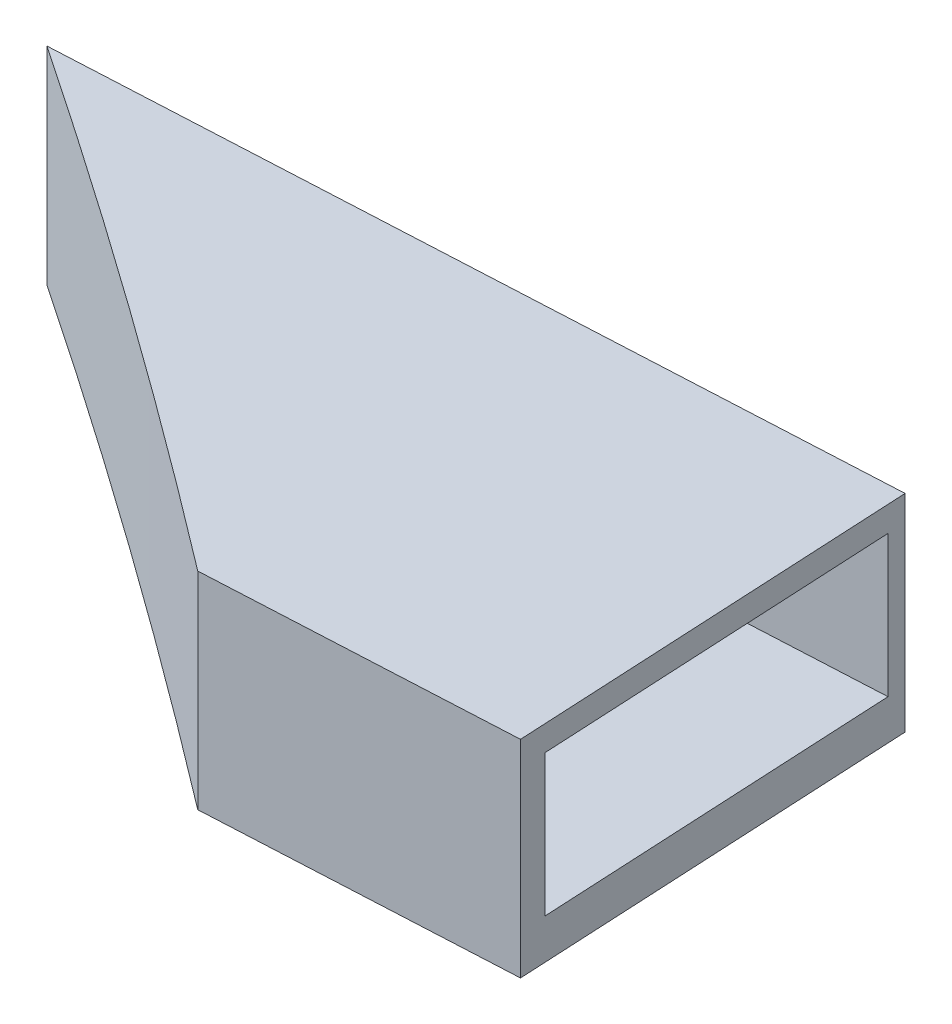
ISO-10303-21;
HEADER;
FILE_DESCRIPTION(('STEP AP214'),'2;1');
FILE_NAME('part.step','',(''),(''),'','','');
FILE_SCHEMA(('AUTOMOTIVE_DESIGN { 1 0 10303 214 1 1 1 1 }'));
ENDSEC;
DATA;
#1=APPLICATION_CONTEXT('core data for automotive mechanical design processes');
#2=APPLICATION_PROTOCOL_DEFINITION('international standard','automotive_design',2000,#1);
#3=PRODUCT_CONTEXT('',#1,'mechanical');
#4=PRODUCT('Part','Part','',(#3));
#5=PRODUCT_RELATED_PRODUCT_CATEGORY('part','',(#4));
#6=PRODUCT_DEFINITION_FORMATION('','',#4);
#7=PRODUCT_DEFINITION_CONTEXT('part definition',#1,'design');
#8=PRODUCT_DEFINITION('design','',#6,#7);
#9=PRODUCT_DEFINITION_SHAPE('','',#8);
#10=(LENGTH_UNIT() NAMED_UNIT(*) SI_UNIT(.MILLI.,.METRE.));
#11=(NAMED_UNIT(*) PLANE_ANGLE_UNIT() SI_UNIT($,.RADIAN.));
#12=(NAMED_UNIT(*) SI_UNIT($,.STERADIAN.) SOLID_ANGLE_UNIT());
#13=UNCERTAINTY_MEASURE_WITH_UNIT(LENGTH_MEASURE(1.E-05),#10,'distance_accuracy_value','');
#14=(GEOMETRIC_REPRESENTATION_CONTEXT(3) GLOBAL_UNCERTAINTY_ASSIGNED_CONTEXT((#13)) GLOBAL_UNIT_ASSIGNED_CONTEXT((#10,
#11,#12)) REPRESENTATION_CONTEXT('',''));
#15=CARTESIAN_POINT('',(0.,0.,0.));
#16=DIRECTION('',(0.,0.,1.));
#17=DIRECTION('',(1.,0.,0.));
#18=AXIS2_PLACEMENT_3D('',#15,#16,#17);
#19=CARTESIAN_POINT('',(625.440328141311,19.,-824.647674335272));
#20=DIRECTION('',(-0.998701891270845,0.,0.0509365524160916));
#21=DIRECTION('',(0.0509365524160916,0.,0.998701891270845));
#22=AXIS2_PLACEMENT_3D('',#19,#20,#21);
#23=PLANE('',#22);
#24=DIRECTION('',(-0.0509365524160912,0.,-0.998701891270845));
#25=VECTOR('',#24,1.);
#26=CARTESIAN_POINT('',(627.218454590812,3.68936553362982,-789.784336244997));
#27=LINE('',#26,#25);
#28=CARTESIAN_POINT('',(627.218454590812,3.68936553362982,-789.784336244988));
#29=VERTEX_POINT('',#28);
#30=CARTESIAN_POINT('',(625.524814222977,3.68936553362982,-822.991174129753));
#31=VERTEX_POINT('',#30);
#32=EDGE_CURVE('E135',#29,#31,#27,.T.);
#33=ORIENTED_EDGE('',*,*,#32,.F.);
#34=DIRECTION('',(0.,-1.,0.));
#35=VECTOR('',#34,1.);
#36=CARTESIAN_POINT('',(627.218454590812,16.6893655336298,-789.784336244997));
#37=LINE('',#36,#35);
#38=CARTESIAN_POINT('',(627.218454590812,16.6893655336298,-789.784336244997));
#39=VERTEX_POINT('',#38);
#40=EDGE_CURVE('E47',#39,#29,#37,.T.);
#41=ORIENTED_EDGE('',*,*,#40,.F.);
#42=DIRECTION('',(0.0509365524160912,0.,0.998701891270845));
#43=VECTOR('',#42,1.);
#44=CARTESIAN_POINT('',(627.218454590812,16.6893655336298,-789.784336244997));
#45=LINE('',#44,#43);
#46=CARTESIAN_POINT('',(625.524814222977,16.6893655336298,-822.991174129753));
#47=VERTEX_POINT('',#46);
#48=EDGE_CURVE('E126',#47,#39,#45,.T.);
#49=ORIENTED_EDGE('',*,*,#48,.F.);
#50=DIRECTION('',(0.,1.,0.));
#51=VECTOR('',#50,1.);
#52=CARTESIAN_POINT('',(625.524814222977,16.6893655336298,-822.991174129753));
#53=LINE('',#52,#51);
#54=EDGE_CURVE('E129',#31,#47,#53,.T.);
#55=ORIENTED_EDGE('',*,*,#54,.F.);
#56=EDGE_LOOP('',(#33,#41,#49,#55));
#57=FACE_BOUND('',#56,.T.);
#58=DIRECTION('',(-0.0509365524160916,0.,-0.998701891270845));
#59=VECTOR('',#58,1.);
#60=CARTESIAN_POINT('',(625.440328141311,0.,-824.647674335272));
#61=LINE('',#60,#59);
#62=CARTESIAN_POINT('',(627.340180934305,0.,-787.397674335272));
#63=VERTEX_POINT('',#62);
#64=CARTESIAN_POINT('',(625.440328141311,0.,-824.647674335272));
#65=VERTEX_POINT('',#64);
#66=EDGE_CURVE('E141',#63,#65,#61,.T.);
#67=ORIENTED_EDGE('',*,*,#66,.T.);
#68=DIRECTION('',(0.,-1.,0.));
#69=VECTOR('',#68,1.);
#70=CARTESIAN_POINT('',(625.440328141311,19.,-824.647674335272));
#71=LINE('',#70,#69);
#72=CARTESIAN_POINT('',(625.440328141311,19.,-824.647674335272));
#73=VERTEX_POINT('',#72);
#74=EDGE_CURVE('E11',#73,#65,#71,.T.);
#75=ORIENTED_EDGE('',*,*,#74,.F.);
#76=DIRECTION('',(-0.0509365524160916,0.,-0.998701891270845));
#77=VECTOR('',#76,1.);
#78=CARTESIAN_POINT('',(625.440328141311,19.,-824.647674335272));
#79=LINE('',#78,#77);
#80=CARTESIAN_POINT('',(627.340180934305,19.,-787.397674335272));
#81=VERTEX_POINT('',#80);
#82=EDGE_CURVE('E145',#81,#73,#79,.T.);
#83=ORIENTED_EDGE('',*,*,#82,.F.);
#84=DIRECTION('',(0.,-1.,0.));
#85=VECTOR('',#84,1.);
#86=CARTESIAN_POINT('',(627.340180934305,19.,-787.397674335272));
#87=LINE('',#86,#85);
#88=EDGE_CURVE('E151',#81,#63,#87,.T.);
#89=ORIENTED_EDGE('',*,*,#88,.T.);
#90=EDGE_LOOP('',(#67,#75,#83,#89));
#91=FACE_BOUND('',#90,.T.);
#92=ADVANCED_FACE('F33',(#57,#91),#23,.F.);
#93=CARTESIAN_POINT('',(550.386370435803,19.,-820.819715377632));
#94=DIRECTION('',(0.0509365524160911,0.,0.998701891270845));
#95=DIRECTION('',(0.998701891270845,0.,-0.0509365524160911));
#96=AXIS2_PLACEMENT_3D('',#93,#94,#95);
#97=PLANE('',#96);
#98=DIRECTION('',(-0.998701891270845,0.,0.050936552416091));
#99=VECTOR('',#98,1.);
#100=CARTESIAN_POINT('',(550.386370435803,0.,-820.819715377632));
#101=LINE('',#100,#99);
#102=CARTESIAN_POINT('',(550.386370435803,0.,-820.819715377632));
#103=VERTEX_POINT('',#102);
#104=EDGE_CURVE('E154',#65,#103,#101,.T.);
#105=ORIENTED_EDGE('',*,*,#104,.T.);
#106=DIRECTION('',(0.,-1.,0.));
#107=VECTOR('',#106,1.);
#108=CARTESIAN_POINT('',(550.386370435803,19.,-820.819715377632));
#109=LINE('',#108,#107);
#110=CARTESIAN_POINT('',(550.386370435803,19.,-820.819715377632));
#111=VERTEX_POINT('',#110);
#112=EDGE_CURVE('E40',#111,#103,#109,.T.);
#113=ORIENTED_EDGE('',*,*,#112,.F.);
#114=DIRECTION('',(-0.998701891270845,0.,0.050936552416091));
#115=VECTOR('',#114,1.);
#116=CARTESIAN_POINT('',(550.386370435803,19.,-820.819715377632));
#117=LINE('',#116,#115);
#118=EDGE_CURVE('E84',#73,#111,#117,.T.);
#119=ORIENTED_EDGE('',*,*,#118,.F.);
#120=ORIENTED_EDGE('',*,*,#74,.T.);
#121=EDGE_LOOP('',(#105,#113,#119,#120));
#122=FACE_BOUND('',#121,.T.);
#123=ADVANCED_FACE('F182',(#122),#97,.F.);
#124=CARTESIAN_POINT('',(0.,19.,0.));
#125=DIRECTION('',(0.,-1.,0.));
#126=DIRECTION('',(0.,0.,-1.));
#127=AXIS2_PLACEMENT_3D('',#124,#125,#126);
#128=CYLINDRICAL_SURFACE('',#127,988.26624039988);
#129=CARTESIAN_POINT('',(0.,0.,0.));
#130=DIRECTION('',(0.,-1.,0.));
#131=DIRECTION('',(0.,0.,1.));
#132=AXIS2_PLACEMENT_3D('',#129,#130,#131);
#133=CIRCLE('',#132,988.26624039988);
#134=CARTESIAN_POINT('',(599.115957856186,0.,-785.958161072318));
#135=VERTEX_POINT('',#134);
#136=EDGE_CURVE('E156',#103,#135,#133,.T.);
#137=ORIENTED_EDGE('',*,*,#136,.T.);
#138=DIRECTION('',(0.,-1.,0.));
#139=VECTOR('',#138,1.);
#140=CARTESIAN_POINT('',(599.115957856186,19.,-785.958161072318));
#141=LINE('',#140,#139);
#142=CARTESIAN_POINT('',(599.115957856186,19.,-785.958161072318));
#143=VERTEX_POINT('',#142);
#144=EDGE_CURVE('E160',#143,#135,#141,.T.);
#145=ORIENTED_EDGE('',*,*,#144,.F.);
#146=CARTESIAN_POINT('',(0.,19.,0.));
#147=DIRECTION('',(0.,-1.,0.));
#148=DIRECTION('',(0.,0.,1.));
#149=AXIS2_PLACEMENT_3D('',#146,#147,#148);
#150=CIRCLE('',#149,988.26624039988);
#151=EDGE_CURVE('E148',#111,#143,#150,.T.);
#152=ORIENTED_EDGE('',*,*,#151,.F.);
#153=ORIENTED_EDGE('',*,*,#112,.T.);
#154=EDGE_LOOP('',(#137,#145,#152,#153));
#155=FACE_BOUND('',#154,.T.);
#156=ADVANCED_FACE('F165',(#155),#128,.F.);
#157=CARTESIAN_POINT('',(627.340180934305,19.,-787.397674335272));
#158=DIRECTION('',(-0.050936552416088,0.,-0.998701891270845));
#159=DIRECTION('',(-0.998701891270845,0.,0.050936552416088));
#160=AXIS2_PLACEMENT_3D('',#157,#158,#159);
#161=PLANE('',#160);
#162=DIRECTION('',(0.998701891270845,0.,-0.050936552416088));
#163=VECTOR('',#162,1.);
#164=CARTESIAN_POINT('',(627.340180934305,0.,-787.397674335272));
#165=LINE('',#164,#163);
#166=EDGE_CURVE('E77',#135,#63,#165,.T.);
#167=ORIENTED_EDGE('',*,*,#166,.T.);
#168=ORIENTED_EDGE('',*,*,#88,.F.);
#169=DIRECTION('',(0.998701891270845,0.,-0.050936552416088));
#170=VECTOR('',#169,1.);
#171=CARTESIAN_POINT('',(627.340180934305,19.,-787.397674335272));
#172=LINE('',#171,#170);
#173=EDGE_CURVE('E56',#143,#81,#172,.T.);
#174=ORIENTED_EDGE('',*,*,#173,.F.);
#175=ORIENTED_EDGE('',*,*,#144,.T.);
#176=EDGE_LOOP('',(#167,#168,#174,#175));
#177=FACE_BOUND('',#176,.T.);
#178=ADVANCED_FACE('F173',(#177),#161,.F.);
#179=CARTESIAN_POINT('',(0.,19.,0.));
#180=DIRECTION('',(0.,1.,0.));
#181=DIRECTION('',(0.,0.,1.));
#182=AXIS2_PLACEMENT_3D('',#179,#180,#181);
#183=PLANE('',#182);
#184=ORIENTED_EDGE('',*,*,#82,.T.);
#185=ORIENTED_EDGE('',*,*,#118,.T.);
#186=ORIENTED_EDGE('',*,*,#151,.T.);
#187=ORIENTED_EDGE('',*,*,#173,.T.);
#188=EDGE_LOOP('',(#184,#185,#186,#187));
#189=FACE_BOUND('',#188,.T.);
#190=ADVANCED_FACE('F175',(#189),#183,.T.);
#191=CARTESIAN_POINT('',(0.,0.,0.));
#192=DIRECTION('',(0.,1.,0.));
#193=DIRECTION('',(0.,0.,1.));
#194=AXIS2_PLACEMENT_3D('',#191,#192,#193);
#195=PLANE('',#194);
#196=ORIENTED_EDGE('',*,*,#66,.F.);
#197=ORIENTED_EDGE('',*,*,#166,.F.);
#198=ORIENTED_EDGE('',*,*,#136,.F.);
#199=ORIENTED_EDGE('',*,*,#104,.F.);
#200=EDGE_LOOP('',(#196,#197,#198,#199));
#201=FACE_BOUND('',#200,.T.);
#202=ADVANCED_FACE('F169',(#201),#195,.F.);
#203=CARTESIAN_POINT('',(608.243118656666,16.6893655336298,-788.816541749091));
#204=DIRECTION('',(0.0509365524160913,0.,0.998701891270845));
#205=DIRECTION('',(0.998701891270845,0.,-0.0509365524160913));
#206=AXIS2_PLACEMENT_3D('',#203,#204,#205);
#207=PLANE('',#206);
#208=ORIENTED_EDGE('',*,*,#40,.T.);
#209=DIRECTION('',(0.998701891270845,0.,-0.0509365524160913));
#210=VECTOR('',#209,1.);
#211=CARTESIAN_POINT('',(608.243118656666,3.68936553362982,-788.816541749091));
#212=LINE('',#211,#210);
#213=CARTESIAN_POINT('',(608.243118656666,3.68936553362982,-788.816541749091));
#214=VERTEX_POINT('',#213);
#215=EDGE_CURVE('E104',#214,#29,#212,.T.);
#216=ORIENTED_EDGE('',*,*,#215,.F.);
#217=DIRECTION('',(0.,-1.,0.));
#218=VECTOR('',#217,1.);
#219=CARTESIAN_POINT('',(608.243118656666,16.6893655336298,-788.816541749091));
#220=LINE('',#219,#218);
#221=CARTESIAN_POINT('',(608.243118656666,16.6893655336298,-788.816541749091));
#222=VERTEX_POINT('',#221);
#223=EDGE_CURVE('E108',#222,#214,#220,.T.);
#224=ORIENTED_EDGE('',*,*,#223,.F.);
#225=DIRECTION('',(0.998701891270845,0.,-0.0509365524160913));
#226=VECTOR('',#225,1.);
#227=CARTESIAN_POINT('',(608.243118656666,16.6893655336298,-788.816541749091));
#228=LINE('',#227,#226);
#229=EDGE_CURVE('E139',#222,#39,#228,.T.);
#230=ORIENTED_EDGE('',*,*,#229,.T.);
#231=EDGE_LOOP('',(#208,#216,#224,#230));
#232=FACE_BOUND('',#231,.T.);
#233=ADVANCED_FACE('F106',(#232),#207,.F.);
#234=CARTESIAN_POINT('',(608.243118656666,16.6893655336298,-788.816541749091));
#235=DIRECTION('',(0.,1.,0.));
#236=DIRECTION('',(0.,0.,1.));
#237=AXIS2_PLACEMENT_3D('',#234,#235,#236);
#238=PLANE('',#237);
#239=ORIENTED_EDGE('',*,*,#48,.T.);
#240=ORIENTED_EDGE('',*,*,#229,.F.);
#241=DIRECTION('',(0.0509365524160912,0.,0.998701891270845));
#242=VECTOR('',#241,1.);
#243=CARTESIAN_POINT('',(608.243118656666,16.6893655336298,-788.816541749091));
#244=LINE('',#243,#242);
#245=CARTESIAN_POINT('',(606.549478288831,16.6893655336298,-822.023379633847));
#246=VERTEX_POINT('',#245);
#247=EDGE_CURVE('E114',#246,#222,#244,.T.);
#248=ORIENTED_EDGE('',*,*,#247,.F.);
#249=DIRECTION('',(0.998701891270845,0.,-0.0509365524160913));
#250=VECTOR('',#249,1.);
#251=CARTESIAN_POINT('',(606.549478288831,16.6893655336298,-822.023379633847));
#252=LINE('',#251,#250);
#253=EDGE_CURVE('E142',#246,#47,#252,.T.);
#254=ORIENTED_EDGE('',*,*,#253,.T.);
#255=EDGE_LOOP('',(#239,#240,#248,#254));
#256=FACE_BOUND('',#255,.T.);
#257=ADVANCED_FACE('F195',(#256),#238,.F.);
#258=CARTESIAN_POINT('',(606.549478288831,16.6893655336298,-822.023379633847));
#259=DIRECTION('',(-0.0509365524160913,0.,-0.998701891270845));
#260=DIRECTION('',(-0.998701891270845,0.,0.0509365524160913));
#261=AXIS2_PLACEMENT_3D('',#258,#259,#260);
#262=PLANE('',#261);
#263=ORIENTED_EDGE('',*,*,#54,.T.);
#264=ORIENTED_EDGE('',*,*,#253,.F.);
#265=DIRECTION('',(0.,1.,0.));
#266=VECTOR('',#265,1.);
#267=CARTESIAN_POINT('',(606.549478288831,16.6893655336298,-822.023379633847));
#268=LINE('',#267,#266);
#269=CARTESIAN_POINT('',(606.549478288831,3.68936553362982,-822.023379633847));
#270=VERTEX_POINT('',#269);
#271=EDGE_CURVE('E122',#270,#246,#268,.T.);
#272=ORIENTED_EDGE('',*,*,#271,.F.);
#273=DIRECTION('',(0.998701891270845,0.,-0.0509365524160913));
#274=VECTOR('',#273,1.);
#275=CARTESIAN_POINT('',(606.549478288831,3.68936553362982,-822.023379633847));
#276=LINE('',#275,#274);
#277=EDGE_CURVE('E113',#270,#31,#276,.T.);
#278=ORIENTED_EDGE('',*,*,#277,.T.);
#279=EDGE_LOOP('',(#263,#264,#272,#278));
#280=FACE_BOUND('',#279,.T.);
#281=ADVANCED_FACE('F193',(#280),#262,.F.);
#282=CARTESIAN_POINT('',(608.243118656666,3.68936553362982,-788.816541749091));
#283=DIRECTION('',(0.,-1.,0.));
#284=DIRECTION('',(0.,0.,-1.));
#285=AXIS2_PLACEMENT_3D('',#282,#283,#284);
#286=PLANE('',#285);
#287=ORIENTED_EDGE('',*,*,#32,.T.);
#288=ORIENTED_EDGE('',*,*,#277,.F.);
#289=DIRECTION('',(-0.0509365524160912,0.,-0.998701891270845));
#290=VECTOR('',#289,1.);
#291=CARTESIAN_POINT('',(608.243118656666,3.68936553362982,-788.816541749091));
#292=LINE('',#291,#290);
#293=EDGE_CURVE('E117',#214,#270,#292,.T.);
#294=ORIENTED_EDGE('',*,*,#293,.F.);
#295=ORIENTED_EDGE('',*,*,#215,.T.);
#296=EDGE_LOOP('',(#287,#288,#294,#295));
#297=FACE_BOUND('',#296,.T.);
#298=ADVANCED_FACE('F118',(#297),#286,.F.);
#299=CARTESIAN_POINT('',(646.792449837558,0.,-32.988199793594));
#300=DIRECTION('',(0.998701891270845,0.,-0.0509365524160912));
#301=DIRECTION('',(-0.0509365524160912,0.,-0.998701891270845));
#302=AXIS2_PLACEMENT_3D('',#299,#300,#301);
#303=PLANE('',#302);
#304=ORIENTED_EDGE('',*,*,#223,.T.);
#305=ORIENTED_EDGE('',*,*,#293,.T.);
#306=ORIENTED_EDGE('',*,*,#271,.T.);
#307=ORIENTED_EDGE('',*,*,#247,.T.);
#308=EDGE_LOOP('',(#304,#305,#306,#307));
#309=FACE_BOUND('',#308,.T.);
#310=ADVANCED_FACE('F124',(#309),#303,.T.);
#311=CLOSED_SHELL('',(#92,#123,#156,#178,#190,#202,#233,#257,#281,#298,#310));
#312=MANIFOLD_SOLID_BREP('B2',#311);
#313=ADVANCED_BREP_SHAPE_REPRESENTATION('',(#18,#312),#14);
#314=SHAPE_DEFINITION_REPRESENTATION(#9,#313);
ENDSEC;
END-ISO-10303-21;
